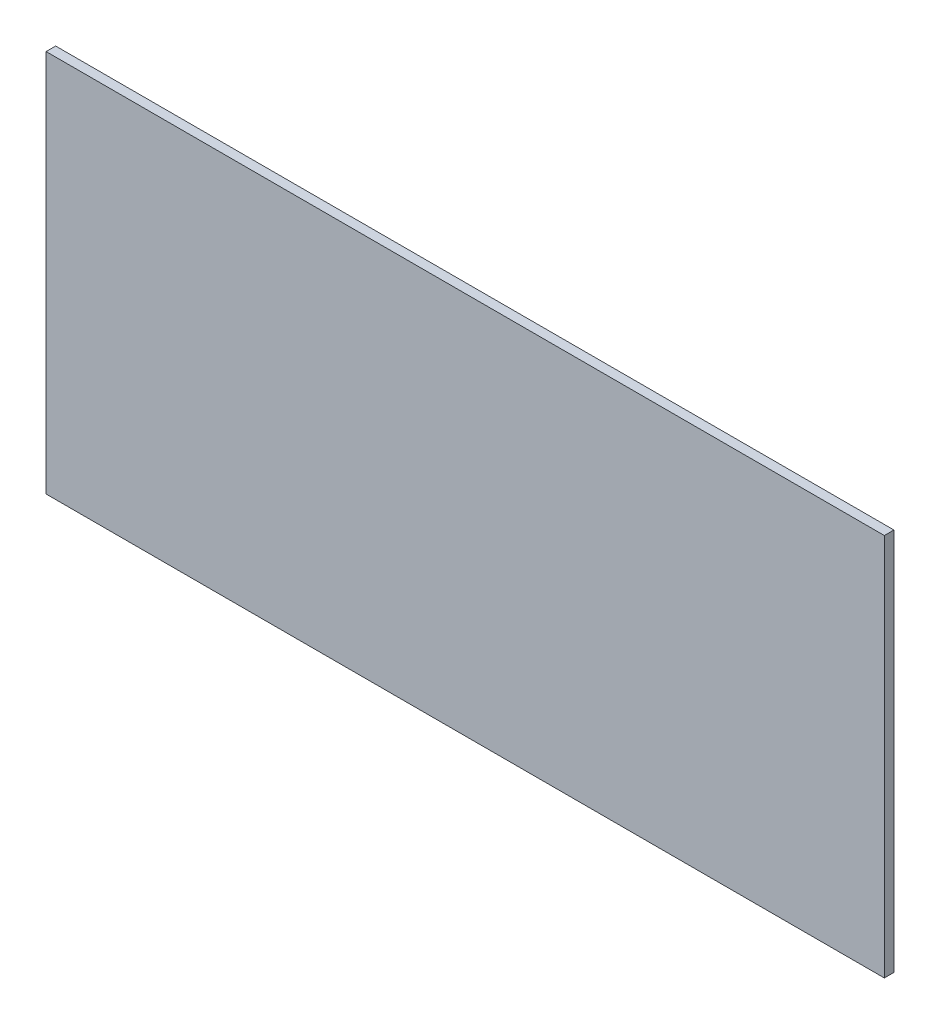
ISO-10303-21;
HEADER;
FILE_DESCRIPTION(('STEP AP214'),'2;1');
FILE_NAME('part.step','',(''),(''),'','','');
FILE_SCHEMA(('AUTOMOTIVE_DESIGN { 1 0 10303 214 1 1 1 1 }'));
ENDSEC;
DATA;
#1=APPLICATION_CONTEXT('core data for automotive mechanical design processes');
#2=APPLICATION_PROTOCOL_DEFINITION('international standard','automotive_design',2000,#1);
#3=PRODUCT_CONTEXT('',#1,'mechanical');
#4=PRODUCT('Part','Part','',(#3));
#5=PRODUCT_RELATED_PRODUCT_CATEGORY('part','',(#4));
#6=PRODUCT_DEFINITION_FORMATION('','',#4);
#7=PRODUCT_DEFINITION_CONTEXT('part definition',#1,'design');
#8=PRODUCT_DEFINITION('design','',#6,#7);
#9=PRODUCT_DEFINITION_SHAPE('','',#8);
#10=(LENGTH_UNIT() NAMED_UNIT(*) SI_UNIT(.MILLI.,.METRE.));
#11=(NAMED_UNIT(*) PLANE_ANGLE_UNIT() SI_UNIT($,.RADIAN.));
#12=(NAMED_UNIT(*) SI_UNIT($,.STERADIAN.) SOLID_ANGLE_UNIT());
#13=UNCERTAINTY_MEASURE_WITH_UNIT(LENGTH_MEASURE(1.E-05),#10,'distance_accuracy_value','');
#14=(GEOMETRIC_REPRESENTATION_CONTEXT(3) GLOBAL_UNCERTAINTY_ASSIGNED_CONTEXT((#13)) GLOBAL_UNIT_ASSIGNED_CONTEXT((#10,
#11,#12)) REPRESENTATION_CONTEXT('',''));
#15=CARTESIAN_POINT('',(0.,0.,0.));
#16=DIRECTION('',(0.,0.,1.));
#17=DIRECTION('',(1.,0.,0.));
#18=AXIS2_PLACEMENT_3D('',#15,#16,#17);
#19=CARTESIAN_POINT('',(175.,-80.,4.));
#20=DIRECTION('',(-1.,0.,0.));
#21=DIRECTION('',(0.,0.,1.));
#22=AXIS2_PLACEMENT_3D('',#19,#20,#21);
#23=PLANE('',#22);
#24=DIRECTION('',(0.,1.,0.));
#25=VECTOR('',#24,1.);
#26=CARTESIAN_POINT('',(175.,-80.,0.));
#27=LINE('',#26,#25);
#28=CARTESIAN_POINT('',(175.,-80.,0.));
#29=VERTEX_POINT('',#28);
#30=CARTESIAN_POINT('',(175.,80.,0.));
#31=VERTEX_POINT('',#30);
#32=EDGE_CURVE('E103',#29,#31,#27,.T.);
#33=ORIENTED_EDGE('',*,*,#32,.T.);
#34=DIRECTION('',(0.,0.,-1.));
#35=VECTOR('',#34,1.);
#36=CARTESIAN_POINT('',(175.,80.,4.));
#37=LINE('',#36,#35);
#38=CARTESIAN_POINT('',(175.,80.,4.));
#39=VERTEX_POINT('',#38);
#40=EDGE_CURVE('E11',#39,#31,#37,.T.);
#41=ORIENTED_EDGE('',*,*,#40,.F.);
#42=DIRECTION('',(0.,1.,0.));
#43=VECTOR('',#42,1.);
#44=CARTESIAN_POINT('',(175.,-80.,4.));
#45=LINE('',#44,#43);
#46=CARTESIAN_POINT('',(175.,-80.,4.));
#47=VERTEX_POINT('',#46);
#48=EDGE_CURVE('E91',#47,#39,#45,.T.);
#49=ORIENTED_EDGE('',*,*,#48,.F.);
#50=DIRECTION('',(0.,0.,-1.));
#51=VECTOR('',#50,1.);
#52=CARTESIAN_POINT('',(175.,-80.,4.));
#53=LINE('',#52,#51);
#54=EDGE_CURVE('E99',#47,#29,#53,.T.);
#55=ORIENTED_EDGE('',*,*,#54,.T.);
#56=EDGE_LOOP('',(#33,#41,#49,#55));
#57=FACE_BOUND('',#56,.T.);
#58=ADVANCED_FACE('F40',(#57),#23,.F.);
#59=CARTESIAN_POINT('',(-175.,80.,4.));
#60=DIRECTION('',(0.,-1.,0.));
#61=DIRECTION('',(0.,0.,-1.));
#62=AXIS2_PLACEMENT_3D('',#59,#60,#61);
#63=PLANE('',#62);
#64=DIRECTION('',(-1.,0.,0.));
#65=VECTOR('',#64,1.);
#66=CARTESIAN_POINT('',(-175.,80.,0.));
#67=LINE('',#66,#65);
#68=CARTESIAN_POINT('',(-175.,80.,0.));
#69=VERTEX_POINT('',#68);
#70=EDGE_CURVE('E95',#31,#69,#67,.T.);
#71=ORIENTED_EDGE('',*,*,#70,.T.);
#72=DIRECTION('',(0.,0.,-1.));
#73=VECTOR('',#72,1.);
#74=CARTESIAN_POINT('',(-175.,80.,4.));
#75=LINE('',#74,#73);
#76=CARTESIAN_POINT('',(-175.,80.,4.));
#77=VERTEX_POINT('',#76);
#78=EDGE_CURVE('E48',#77,#69,#75,.T.);
#79=ORIENTED_EDGE('',*,*,#78,.F.);
#80=DIRECTION('',(-1.,0.,0.));
#81=VECTOR('',#80,1.);
#82=CARTESIAN_POINT('',(-175.,80.,4.));
#83=LINE('',#82,#81);
#84=EDGE_CURVE('E86',#39,#77,#83,.T.);
#85=ORIENTED_EDGE('',*,*,#84,.F.);
#86=ORIENTED_EDGE('',*,*,#40,.T.);
#87=EDGE_LOOP('',(#71,#79,#85,#86));
#88=FACE_BOUND('',#87,.T.);
#89=ADVANCED_FACE('F94',(#88),#63,.F.);
#90=CARTESIAN_POINT('',(-175.,-80.,4.));
#91=DIRECTION('',(1.,0.,0.));
#92=DIRECTION('',(0.,0.,-1.));
#93=AXIS2_PLACEMENT_3D('',#90,#91,#92);
#94=PLANE('',#93);
#95=DIRECTION('',(0.,-1.,0.));
#96=VECTOR('',#95,1.);
#97=CARTESIAN_POINT('',(-175.,-80.,0.));
#98=LINE('',#97,#96);
#99=CARTESIAN_POINT('',(-175.,-80.,0.));
#100=VERTEX_POINT('',#99);
#101=EDGE_CURVE('E73',#69,#100,#98,.T.);
#102=ORIENTED_EDGE('',*,*,#101,.T.);
#103=DIRECTION('',(0.,0.,-1.));
#104=VECTOR('',#103,1.);
#105=CARTESIAN_POINT('',(-175.,-80.,4.));
#106=LINE('',#105,#104);
#107=CARTESIAN_POINT('',(-175.,-80.,4.));
#108=VERTEX_POINT('',#107);
#109=EDGE_CURVE('E96',#108,#100,#106,.T.);
#110=ORIENTED_EDGE('',*,*,#109,.F.);
#111=DIRECTION('',(0.,-1.,0.));
#112=VECTOR('',#111,1.);
#113=CARTESIAN_POINT('',(-175.,-80.,4.));
#114=LINE('',#113,#112);
#115=EDGE_CURVE('E89',#77,#108,#114,.T.);
#116=ORIENTED_EDGE('',*,*,#115,.F.);
#117=ORIENTED_EDGE('',*,*,#78,.T.);
#118=EDGE_LOOP('',(#102,#110,#116,#117));
#119=FACE_BOUND('',#118,.T.);
#120=ADVANCED_FACE('F97',(#119),#94,.F.);
#121=CARTESIAN_POINT('',(-175.,-80.,4.));
#122=DIRECTION('',(0.,1.,0.));
#123=DIRECTION('',(0.,0.,1.));
#124=AXIS2_PLACEMENT_3D('',#121,#122,#123);
#125=PLANE('',#124);
#126=DIRECTION('',(1.,0.,0.));
#127=VECTOR('',#126,1.);
#128=CARTESIAN_POINT('',(-175.,-80.,0.));
#129=LINE('',#128,#127);
#130=EDGE_CURVE('E79',#100,#29,#129,.T.);
#131=ORIENTED_EDGE('',*,*,#130,.T.);
#132=ORIENTED_EDGE('',*,*,#54,.F.);
#133=DIRECTION('',(1.,0.,0.));
#134=VECTOR('',#133,1.);
#135=CARTESIAN_POINT('',(-175.,-80.,4.));
#136=LINE('',#135,#134);
#137=EDGE_CURVE('E56',#108,#47,#136,.T.);
#138=ORIENTED_EDGE('',*,*,#137,.F.);
#139=ORIENTED_EDGE('',*,*,#109,.T.);
#140=EDGE_LOOP('',(#131,#132,#138,#139));
#141=FACE_BOUND('',#140,.T.);
#142=ADVANCED_FACE('F110',(#141),#125,.F.);
#143=CARTESIAN_POINT('',(0.,0.,4.));
#144=DIRECTION('',(0.,0.,-1.));
#145=DIRECTION('',(-1.,0.,0.));
#146=AXIS2_PLACEMENT_3D('',#143,#144,#145);
#147=PLANE('',#146);
#148=ORIENTED_EDGE('',*,*,#48,.T.);
#149=ORIENTED_EDGE('',*,*,#84,.T.);
#150=ORIENTED_EDGE('',*,*,#115,.T.);
#151=ORIENTED_EDGE('',*,*,#137,.T.);
#152=EDGE_LOOP('',(#148,#149,#150,#151));
#153=FACE_BOUND('',#152,.T.);
#154=ADVANCED_FACE('F87',(#153),#147,.F.);
#155=CARTESIAN_POINT('',(0.,0.,0.));
#156=DIRECTION('',(0.,0.,-1.));
#157=DIRECTION('',(-1.,0.,0.));
#158=AXIS2_PLACEMENT_3D('',#155,#156,#157);
#159=PLANE('',#158);
#160=ORIENTED_EDGE('',*,*,#32,.F.);
#161=ORIENTED_EDGE('',*,*,#130,.F.);
#162=ORIENTED_EDGE('',*,*,#101,.F.);
#163=ORIENTED_EDGE('',*,*,#70,.F.);
#164=EDGE_LOOP('',(#160,#161,#162,#163));
#165=FACE_BOUND('',#164,.T.);
#166=ADVANCED_FACE('F113',(#165),#159,.T.);
#167=CLOSED_SHELL('',(#58,#89,#120,#142,#154,#166));
#168=MANIFOLD_SOLID_BREP('B2',#167);
#169=ADVANCED_BREP_SHAPE_REPRESENTATION('',(#18,#168),#14);
#170=SHAPE_DEFINITION_REPRESENTATION(#9,#169);
ENDSEC;
END-ISO-10303-21;
